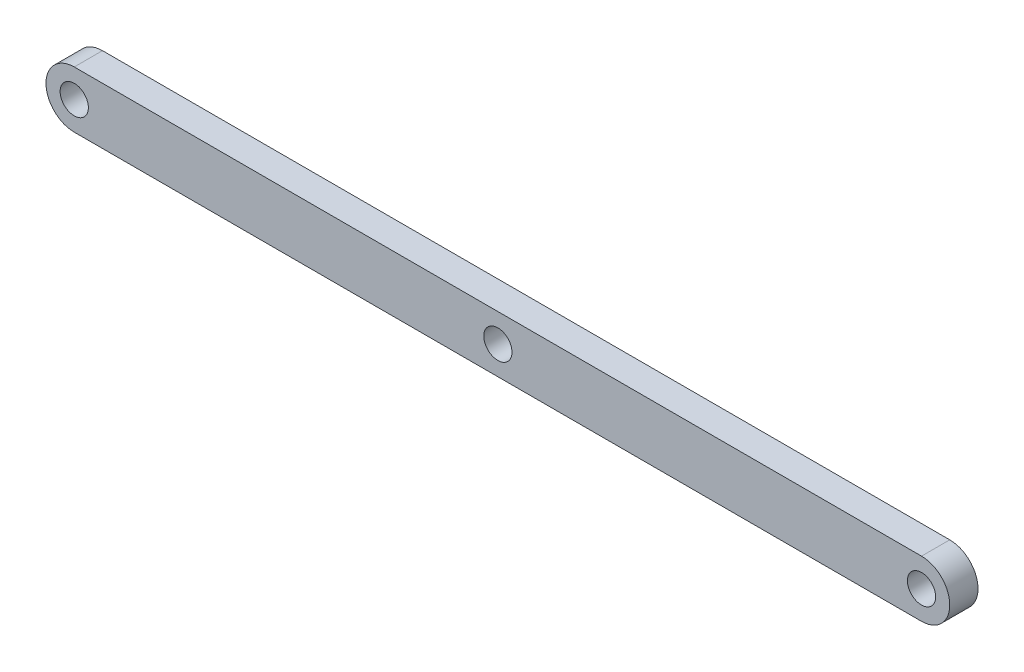
ISO-10303-21;
HEADER;
FILE_DESCRIPTION(('STEP AP214'),'2;1');
FILE_NAME('part.step','',(''),(''),'','','');
FILE_SCHEMA(('AUTOMOTIVE_DESIGN { 1 0 10303 214 1 1 1 1 }'));
ENDSEC;
DATA;
#1=APPLICATION_CONTEXT('core data for automotive mechanical design processes');
#2=APPLICATION_PROTOCOL_DEFINITION('international standard','automotive_design',2000,#1);
#3=PRODUCT_CONTEXT('',#1,'mechanical');
#4=PRODUCT('Part','Part','',(#3));
#5=PRODUCT_RELATED_PRODUCT_CATEGORY('part','',(#4));
#6=PRODUCT_DEFINITION_FORMATION('','',#4);
#7=PRODUCT_DEFINITION_CONTEXT('part definition',#1,'design');
#8=PRODUCT_DEFINITION('design','',#6,#7);
#9=PRODUCT_DEFINITION_SHAPE('','',#8);
#10=(LENGTH_UNIT() NAMED_UNIT(*) SI_UNIT(.MILLI.,.METRE.));
#11=(NAMED_UNIT(*) PLANE_ANGLE_UNIT() SI_UNIT($,.RADIAN.));
#12=(NAMED_UNIT(*) SI_UNIT($,.STERADIAN.) SOLID_ANGLE_UNIT());
#13=UNCERTAINTY_MEASURE_WITH_UNIT(LENGTH_MEASURE(1.E-05),#10,'distance_accuracy_value','');
#14=(GEOMETRIC_REPRESENTATION_CONTEXT(3) GLOBAL_UNCERTAINTY_ASSIGNED_CONTEXT((#13)) GLOBAL_UNIT_ASSIGNED_CONTEXT((#10,
#11,#12)) REPRESENTATION_CONTEXT('',''));
#15=CARTESIAN_POINT('',(0.,0.,0.));
#16=DIRECTION('',(0.,0.,1.));
#17=DIRECTION('',(1.,0.,0.));
#18=AXIS2_PLACEMENT_3D('',#15,#16,#17);
#19=CARTESIAN_POINT('',(0.,0.,10.));
#20=DIRECTION('',(0.,0.,1.));
#21=DIRECTION('',(1.,0.,0.));
#22=AXIS2_PLACEMENT_3D('',#19,#20,#21);
#23=PLANE('',#22);
#24=CARTESIAN_POINT('',(300.,0.,10.));
#25=DIRECTION('',(0.,0.,1.));
#26=DIRECTION('',(1.,0.,0.));
#27=AXIS2_PLACEMENT_3D('',#24,#25,#26);
#28=CIRCLE('',#27,4.99999999999999);
#29=CARTESIAN_POINT('',(305.,0.,10.));
#30=VERTEX_POINT('',#29);
#31=EDGE_CURVE('E134',#30,#30,#28,.T.);
#32=ORIENTED_EDGE('',*,*,#31,.F.);
#33=EDGE_LOOP('',(#32));
#34=FACE_BOUND('',#33,.T.);
#35=CARTESIAN_POINT('',(0.,0.,10.));
#36=DIRECTION('',(0.,0.,1.));
#37=DIRECTION('',(1.,0.,0.));
#38=AXIS2_PLACEMENT_3D('',#35,#36,#37);
#39=CIRCLE('',#38,10.);
#40=CARTESIAN_POINT('',(0.,10.,10.));
#41=VERTEX_POINT('',#40);
#42=CARTESIAN_POINT('',(0.,-10.,10.));
#43=VERTEX_POINT('',#42);
#44=EDGE_CURVE('E92',#41,#43,#39,.T.);
#45=ORIENTED_EDGE('',*,*,#44,.T.);
#46=DIRECTION('',(1.,0.,0.));
#47=VECTOR('',#46,1.);
#48=CARTESIAN_POINT('',(0.,-10.,10.));
#49=LINE('',#48,#47);
#50=CARTESIAN_POINT('',(300.,-10.,10.));
#51=VERTEX_POINT('',#50);
#52=EDGE_CURVE('E87',#43,#51,#49,.T.);
#53=ORIENTED_EDGE('',*,*,#52,.T.);
#54=CARTESIAN_POINT('',(300.,0.,10.));
#55=DIRECTION('',(0.,0.,1.));
#56=DIRECTION('',(1.,0.,0.));
#57=AXIS2_PLACEMENT_3D('',#54,#55,#56);
#58=CIRCLE('',#57,10.);
#59=CARTESIAN_POINT('',(300.,10.,10.));
#60=VERTEX_POINT('',#59);
#61=EDGE_CURVE('E90',#51,#60,#58,.T.);
#62=ORIENTED_EDGE('',*,*,#61,.T.);
#63=DIRECTION('',(-1.,0.,0.));
#64=VECTOR('',#63,1.);
#65=CARTESIAN_POINT('',(0.,10.,10.));
#66=LINE('',#65,#64);
#67=EDGE_CURVE('E57',#60,#41,#66,.T.);
#68=ORIENTED_EDGE('',*,*,#67,.T.);
#69=EDGE_LOOP('',(#45,#53,#62,#68));
#70=FACE_BOUND('',#69,.T.);
#71=CARTESIAN_POINT('',(0.,0.,10.));
#72=DIRECTION('',(0.,0.,1.));
#73=DIRECTION('',(1.,0.,0.));
#74=AXIS2_PLACEMENT_3D('',#71,#72,#73);
#75=CIRCLE('',#74,5.);
#76=CARTESIAN_POINT('',(5.,0.,10.));
#77=VERTEX_POINT('',#76);
#78=EDGE_CURVE('E112',#77,#77,#75,.T.);
#79=ORIENTED_EDGE('',*,*,#78,.F.);
#80=EDGE_LOOP('',(#79));
#81=FACE_BOUND('',#80,.T.);
#82=CARTESIAN_POINT('',(150.,0.,10.));
#83=DIRECTION('',(0.,0.,1.));
#84=DIRECTION('',(1.,0.,0.));
#85=AXIS2_PLACEMENT_3D('',#82,#83,#84);
#86=CIRCLE('',#85,5.00000000000002);
#87=CARTESIAN_POINT('',(155.,0.,10.));
#88=VERTEX_POINT('',#87);
#89=EDGE_CURVE('E142',#88,#88,#86,.T.);
#90=ORIENTED_EDGE('',*,*,#89,.F.);
#91=EDGE_LOOP('',(#90));
#92=FACE_BOUND('',#91,.T.);
#93=ADVANCED_FACE('F39',(#34,#70,#81,#92),#23,.T.);
#94=CARTESIAN_POINT('',(0.,0.,0.));
#95=DIRECTION('',(0.,0.,1.));
#96=DIRECTION('',(1.,0.,0.));
#97=AXIS2_PLACEMENT_3D('',#94,#95,#96);
#98=PLANE('',#97);
#99=CARTESIAN_POINT('',(0.,0.,0.));
#100=DIRECTION('',(0.,0.,1.));
#101=DIRECTION('',(1.,0.,0.));
#102=AXIS2_PLACEMENT_3D('',#99,#100,#101);
#103=CIRCLE('',#102,10.);
#104=CARTESIAN_POINT('',(0.,10.,0.));
#105=VERTEX_POINT('',#104);
#106=CARTESIAN_POINT('',(0.,-10.,0.));
#107=VERTEX_POINT('',#106);
#108=EDGE_CURVE('E108',#105,#107,#103,.T.);
#109=ORIENTED_EDGE('',*,*,#108,.F.);
#110=DIRECTION('',(-1.,0.,0.));
#111=VECTOR('',#110,1.);
#112=CARTESIAN_POINT('',(0.,10.,0.));
#113=LINE('',#112,#111);
#114=CARTESIAN_POINT('',(300.,10.,0.));
#115=VERTEX_POINT('',#114);
#116=EDGE_CURVE('E80',#115,#105,#113,.T.);
#117=ORIENTED_EDGE('',*,*,#116,.F.);
#118=CARTESIAN_POINT('',(300.,0.,0.));
#119=DIRECTION('',(0.,0.,1.));
#120=DIRECTION('',(1.,0.,0.));
#121=AXIS2_PLACEMENT_3D('',#118,#119,#120);
#122=CIRCLE('',#121,10.);
#123=CARTESIAN_POINT('',(300.,-10.,0.));
#124=VERTEX_POINT('',#123);
#125=EDGE_CURVE('E74',#124,#115,#122,.T.);
#126=ORIENTED_EDGE('',*,*,#125,.F.);
#127=DIRECTION('',(1.,0.,0.));
#128=VECTOR('',#127,1.);
#129=CARTESIAN_POINT('',(0.,-10.,0.));
#130=LINE('',#129,#128);
#131=EDGE_CURVE('E97',#107,#124,#130,.T.);
#132=ORIENTED_EDGE('',*,*,#131,.F.);
#133=EDGE_LOOP('',(#109,#117,#126,#132));
#134=FACE_BOUND('',#133,.T.);
#135=CARTESIAN_POINT('',(0.,0.,0.));
#136=DIRECTION('',(0.,0.,1.));
#137=DIRECTION('',(1.,0.,0.));
#138=AXIS2_PLACEMENT_3D('',#135,#136,#137);
#139=CIRCLE('',#138,5.);
#140=CARTESIAN_POINT('',(5.,0.,0.));
#141=VERTEX_POINT('',#140);
#142=EDGE_CURVE('E130',#141,#141,#139,.T.);
#143=ORIENTED_EDGE('',*,*,#142,.T.);
#144=EDGE_LOOP('',(#143));
#145=FACE_BOUND('',#144,.T.);
#146=CARTESIAN_POINT('',(300.,0.,0.));
#147=DIRECTION('',(0.,0.,1.));
#148=DIRECTION('',(1.,0.,0.));
#149=AXIS2_PLACEMENT_3D('',#146,#147,#148);
#150=CIRCLE('',#149,4.99999999999999);
#151=CARTESIAN_POINT('',(305.,0.,0.));
#152=VERTEX_POINT('',#151);
#153=EDGE_CURVE('E138',#152,#152,#150,.T.);
#154=ORIENTED_EDGE('',*,*,#153,.T.);
#155=EDGE_LOOP('',(#154));
#156=FACE_BOUND('',#155,.T.);
#157=CARTESIAN_POINT('',(150.,0.,0.));
#158=DIRECTION('',(0.,0.,1.));
#159=DIRECTION('',(1.,0.,0.));
#160=AXIS2_PLACEMENT_3D('',#157,#158,#159);
#161=CIRCLE('',#160,5.00000000000002);
#162=CARTESIAN_POINT('',(155.,0.,0.));
#163=VERTEX_POINT('',#162);
#164=EDGE_CURVE('E146',#163,#163,#161,.T.);
#165=ORIENTED_EDGE('',*,*,#164,.T.);
#166=EDGE_LOOP('',(#165));
#167=FACE_BOUND('',#166,.T.);
#168=ADVANCED_FACE('F125',(#134,#145,#156,#167),#98,.F.);
#169=CARTESIAN_POINT('',(0.,0.,10.));
#170=DIRECTION('',(0.,0.,-1.));
#171=DIRECTION('',(-1.,0.,0.));
#172=AXIS2_PLACEMENT_3D('',#169,#170,#171);
#173=CYLINDRICAL_SURFACE('',#172,10.);
#174=ORIENTED_EDGE('',*,*,#108,.T.);
#175=DIRECTION('',(0.,0.,-1.));
#176=VECTOR('',#175,1.);
#177=CARTESIAN_POINT('',(0.,-10.,10.));
#178=LINE('',#177,#176);
#179=EDGE_CURVE('E11',#43,#107,#178,.T.);
#180=ORIENTED_EDGE('',*,*,#179,.F.);
#181=ORIENTED_EDGE('',*,*,#44,.F.);
#182=DIRECTION('',(0.,0.,-1.));
#183=VECTOR('',#182,1.);
#184=CARTESIAN_POINT('',(0.,10.,10.));
#185=LINE('',#184,#183);
#186=EDGE_CURVE('E104',#41,#105,#185,.T.);
#187=ORIENTED_EDGE('',*,*,#186,.T.);
#188=EDGE_LOOP('',(#174,#180,#181,#187));
#189=FACE_BOUND('',#188,.T.);
#190=ADVANCED_FACE('F41',(#189),#173,.T.);
#191=CARTESIAN_POINT('',(0.,-10.,10.));
#192=DIRECTION('',(0.,1.,0.));
#193=DIRECTION('',(0.,0.,1.));
#194=AXIS2_PLACEMENT_3D('',#191,#192,#193);
#195=PLANE('',#194);
#196=ORIENTED_EDGE('',*,*,#131,.T.);
#197=DIRECTION('',(0.,0.,-1.));
#198=VECTOR('',#197,1.);
#199=CARTESIAN_POINT('',(300.,-10.,10.));
#200=LINE('',#199,#198);
#201=EDGE_CURVE('E49',#51,#124,#200,.T.);
#202=ORIENTED_EDGE('',*,*,#201,.F.);
#203=ORIENTED_EDGE('',*,*,#52,.F.);
#204=ORIENTED_EDGE('',*,*,#179,.T.);
#205=EDGE_LOOP('',(#196,#202,#203,#204));
#206=FACE_BOUND('',#205,.T.);
#207=ADVANCED_FACE('F96',(#206),#195,.F.);
#208=CARTESIAN_POINT('',(300.,0.,10.));
#209=DIRECTION('',(0.,0.,-1.));
#210=DIRECTION('',(-1.,0.,0.));
#211=AXIS2_PLACEMENT_3D('',#208,#209,#210);
#212=CYLINDRICAL_SURFACE('',#211,10.);
#213=ORIENTED_EDGE('',*,*,#125,.T.);
#214=DIRECTION('',(0.,0.,-1.));
#215=VECTOR('',#214,1.);
#216=CARTESIAN_POINT('',(300.,10.,10.));
#217=LINE('',#216,#215);
#218=EDGE_CURVE('E99',#60,#115,#217,.T.);
#219=ORIENTED_EDGE('',*,*,#218,.F.);
#220=ORIENTED_EDGE('',*,*,#61,.F.);
#221=ORIENTED_EDGE('',*,*,#201,.T.);
#222=EDGE_LOOP('',(#213,#219,#220,#221));
#223=FACE_BOUND('',#222,.T.);
#224=ADVANCED_FACE('F100',(#223),#212,.T.);
#225=CARTESIAN_POINT('',(0.,10.,10.));
#226=DIRECTION('',(0.,-1.,0.));
#227=DIRECTION('',(0.,0.,-1.));
#228=AXIS2_PLACEMENT_3D('',#225,#226,#227);
#229=PLANE('',#228);
#230=ORIENTED_EDGE('',*,*,#116,.T.);
#231=ORIENTED_EDGE('',*,*,#186,.F.);
#232=ORIENTED_EDGE('',*,*,#67,.F.);
#233=ORIENTED_EDGE('',*,*,#218,.T.);
#234=EDGE_LOOP('',(#230,#231,#232,#233));
#235=FACE_BOUND('',#234,.T.);
#236=ADVANCED_FACE('F122',(#235),#229,.F.);
#237=CARTESIAN_POINT('',(0.,0.,10.));
#238=DIRECTION('',(0.,0.,-1.));
#239=DIRECTION('',(-1.,0.,0.));
#240=AXIS2_PLACEMENT_3D('',#237,#238,#239);
#241=CYLINDRICAL_SURFACE('',#240,5.);
#242=ORIENTED_EDGE('',*,*,#78,.T.);
#243=EDGE_LOOP('',(#242));
#244=FACE_BOUND('',#243,.T.);
#245=ORIENTED_EDGE('',*,*,#142,.F.);
#246=EDGE_LOOP('',(#245));
#247=FACE_BOUND('',#246,.T.);
#248=ADVANCED_FACE('F166',(#244,#247),#241,.F.);
#249=CARTESIAN_POINT('',(300.,0.,10.));
#250=DIRECTION('',(0.,0.,-1.));
#251=DIRECTION('',(-1.,0.,0.));
#252=AXIS2_PLACEMENT_3D('',#249,#250,#251);
#253=CYLINDRICAL_SURFACE('',#252,4.99999999999999);
#254=ORIENTED_EDGE('',*,*,#31,.T.);
#255=EDGE_LOOP('',(#254));
#256=FACE_BOUND('',#255,.T.);
#257=ORIENTED_EDGE('',*,*,#153,.F.);
#258=EDGE_LOOP('',(#257));
#259=FACE_BOUND('',#258,.T.);
#260=ADVANCED_FACE('F212',(#256,#259),#253,.F.);
#261=CARTESIAN_POINT('',(150.,0.,10.));
#262=DIRECTION('',(0.,0.,-1.));
#263=DIRECTION('',(-1.,0.,0.));
#264=AXIS2_PLACEMENT_3D('',#261,#262,#263);
#265=CYLINDRICAL_SURFACE('',#264,5.00000000000002);
#266=ORIENTED_EDGE('',*,*,#89,.T.);
#267=EDGE_LOOP('',(#266));
#268=FACE_BOUND('',#267,.T.);
#269=ORIENTED_EDGE('',*,*,#164,.F.);
#270=EDGE_LOOP('',(#269));
#271=FACE_BOUND('',#270,.T.);
#272=ADVANCED_FACE('F154',(#268,#271),#265,.F.);
#273=CLOSED_SHELL('',(#93,#168,#190,#207,#224,#236,#248,#260,#272));
#274=MANIFOLD_SOLID_BREP('B2',#273);
#275=ADVANCED_BREP_SHAPE_REPRESENTATION('',(#18,#274),#14);
#276=SHAPE_DEFINITION_REPRESENTATION(#9,#275);
ENDSEC;
END-ISO-10303-21;
